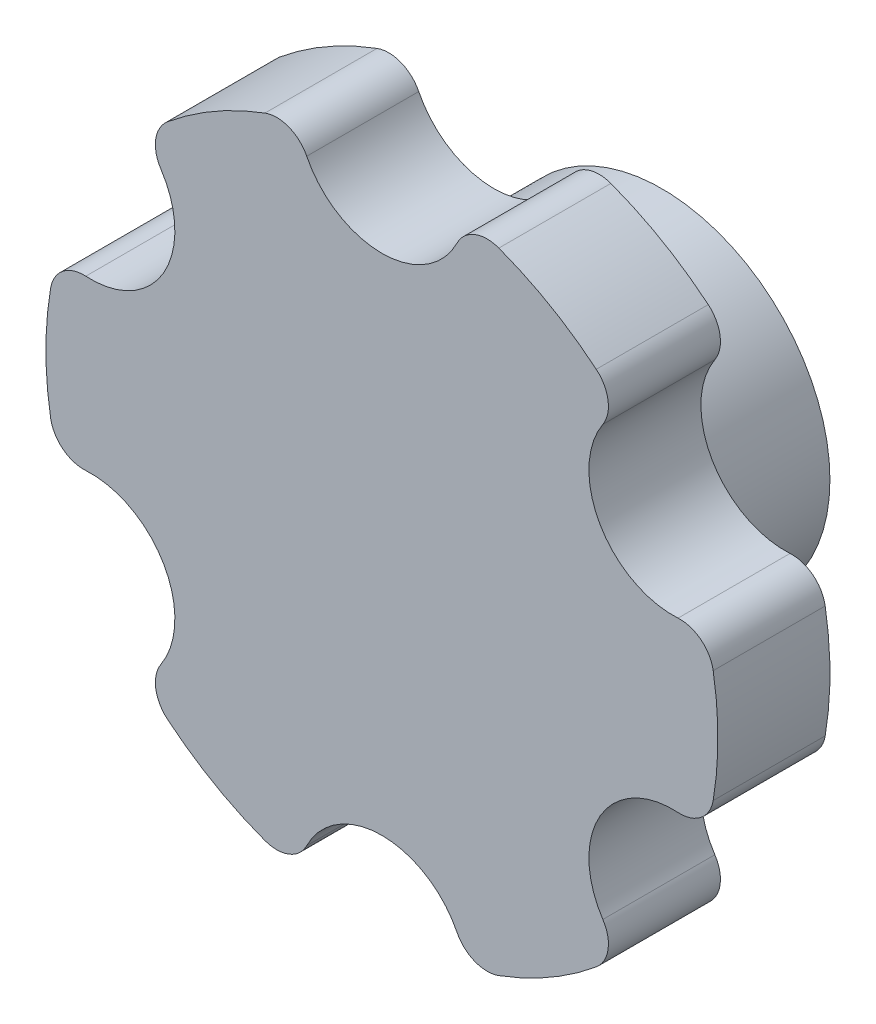
ISO-10303-21;
HEADER;
FILE_DESCRIPTION(('STEP AP214'),'2;1');
FILE_NAME('part.step','',(''),(''),'','','');
FILE_SCHEMA(('AUTOMOTIVE_DESIGN { 1 0 10303 214 1 1 1 1 }'));
ENDSEC;
DATA;
#1=APPLICATION_CONTEXT('core data for automotive mechanical design processes');
#2=APPLICATION_PROTOCOL_DEFINITION('international standard','automotive_design',2000,#1);
#3=PRODUCT_CONTEXT('',#1,'mechanical');
#4=PRODUCT('Part','Part','',(#3));
#5=PRODUCT_RELATED_PRODUCT_CATEGORY('part','',(#4));
#6=PRODUCT_DEFINITION_FORMATION('','',#4);
#7=PRODUCT_DEFINITION_CONTEXT('part definition',#1,'design');
#8=PRODUCT_DEFINITION('design','',#6,#7);
#9=PRODUCT_DEFINITION_SHAPE('','',#8);
#10=(LENGTH_UNIT() NAMED_UNIT(*) SI_UNIT(.MILLI.,.METRE.));
#11=(NAMED_UNIT(*) PLANE_ANGLE_UNIT() SI_UNIT($,.RADIAN.));
#12=(NAMED_UNIT(*) SI_UNIT($,.STERADIAN.) SOLID_ANGLE_UNIT());
#13=UNCERTAINTY_MEASURE_WITH_UNIT(LENGTH_MEASURE(1.E-05),#10,'distance_accuracy_value','');
#14=(GEOMETRIC_REPRESENTATION_CONTEXT(3) GLOBAL_UNCERTAINTY_ASSIGNED_CONTEXT((#13)) GLOBAL_UNIT_ASSIGNED_CONTEXT((#10,
#11,#12)) REPRESENTATION_CONTEXT('',''));
#15=CARTESIAN_POINT('',(0.,0.,0.));
#16=DIRECTION('',(0.,0.,1.));
#17=DIRECTION('',(1.,0.,0.));
#18=AXIS2_PLACEMENT_3D('',#15,#16,#17);
#19=CARTESIAN_POINT('',(0.,0.,25.));
#20=DIRECTION('',(0.,0.,-1.));
#21=DIRECTION('',(-1.,0.,0.));
#22=AXIS2_PLACEMENT_3D('',#19,#20,#21);
#23=CYLINDRICAL_SURFACE('',#22,30.);
#24=DIRECTION('',(0.,0.,-1.));
#25=VECTOR('',#24,1.);
#26=CARTESIAN_POINT('',(29.5767435715904,5.02157741156946,25.));
#27=LINE('',#26,#25);
#28=CARTESIAN_POINT('',(29.5767435715904,5.02157741156946,15.));
#29=VERTEX_POINT('',#28);
#30=CARTESIAN_POINT('',(29.5767435715904,5.02157741156946,25.));
#31=VERTEX_POINT('',#30);
#32=EDGE_CURVE('E274',#29,#31,#27,.F.);
#33=ORIENTED_EDGE('',*,*,#32,.T.);
#34=CARTESIAN_POINT('',(0.,0.,25.));
#35=DIRECTION('',(0.,0.,1.));
#36=DIRECTION('',(1.,0.,0.));
#37=AXIS2_PLACEMENT_3D('',#34,#35,#36);
#38=CIRCLE('',#37,30.);
#39=CARTESIAN_POINT('',(29.5767435715905,-5.02157741156884,25.));
#40=VERTEX_POINT('',#39);
#41=EDGE_CURVE('E416',#40,#31,#38,.T.);
#42=ORIENTED_EDGE('',*,*,#41,.F.);
#43=DIRECTION('',(0.,0.,-1.));
#44=VECTOR('',#43,1.);
#45=CARTESIAN_POINT('',(29.5767435715905,-5.02157741156884,25.));
#46=LINE('',#45,#44);
#47=CARTESIAN_POINT('',(29.5767435715905,-5.02157741156884,15.));
#48=VERTEX_POINT('',#47);
#49=EDGE_CURVE('E279',#40,#48,#46,.T.);
#50=ORIENTED_EDGE('',*,*,#49,.T.);
#51=CARTESIAN_POINT('',(0.,0.,15.));
#52=DIRECTION('',(0.,0.,1.));
#53=DIRECTION('',(1.,0.,0.));
#54=AXIS2_PLACEMENT_3D('',#51,#52,#53);
#55=CIRCLE('',#54,30.);
#56=EDGE_CURVE('E428',#48,#29,#55,.T.);
#57=ORIENTED_EDGE('',*,*,#56,.T.);
#58=EDGE_LOOP('',(#33,#42,#50,#57));
#59=FACE_BOUND('',#58,.T.);
#60=ADVANCED_FACE('F38',(#59),#23,.T.);
#61=DIRECTION('',(0.,0.,-1.));
#62=VECTOR('',#61,1.);
#63=CARTESIAN_POINT('',(19.1371853912839,23.1034225884311,25.));
#64=LINE('',#63,#62);
#65=CARTESIAN_POINT('',(19.1371853912839,23.1034225884311,25.));
#66=VERTEX_POINT('',#65);
#67=CARTESIAN_POINT('',(19.1371853912839,23.1034225884311,15.));
#68=VERTEX_POINT('',#67);
#69=EDGE_CURVE('E304',#66,#68,#64,.T.);
#70=ORIENTED_EDGE('',*,*,#69,.T.);
#71=CARTESIAN_POINT('',(10.4395581803063,28.125,15.));
#72=VERTEX_POINT('',#71);
#73=EDGE_CURVE('E351',#68,#72,#55,.T.);
#74=ORIENTED_EDGE('',*,*,#73,.T.);
#75=DIRECTION('',(0.,0.,-1.));
#76=VECTOR('',#75,1.);
#77=CARTESIAN_POINT('',(10.4395581803063,28.125,25.));
#78=LINE('',#77,#76);
#79=CARTESIAN_POINT('',(10.4395581803063,28.125,25.));
#80=VERTEX_POINT('',#79);
#81=EDGE_CURVE('E372',#72,#80,#78,.F.);
#82=ORIENTED_EDGE('',*,*,#81,.T.);
#83=EDGE_CURVE('E359',#66,#80,#38,.T.);
#84=ORIENTED_EDGE('',*,*,#83,.F.);
#85=EDGE_LOOP('',(#70,#74,#82,#84));
#86=FACE_BOUND('',#85,.T.);
#87=ADVANCED_FACE('F426',(#86),#23,.T.);
#88=DIRECTION('',(0.,0.,-1.));
#89=VECTOR('',#88,1.);
#90=CARTESIAN_POINT('',(19.1371853912844,-23.1034225884307,25.));
#91=LINE('',#90,#89);
#92=CARTESIAN_POINT('',(19.1371853912844,-23.1034225884307,15.));
#93=VERTEX_POINT('',#92);
#94=CARTESIAN_POINT('',(19.1371853912844,-23.1034225884307,25.));
#95=VERTEX_POINT('',#94);
#96=EDGE_CURVE('E246',#93,#95,#91,.F.);
#97=ORIENTED_EDGE('',*,*,#96,.T.);
#98=CARTESIAN_POINT('',(10.4395581803063,-28.125,25.));
#99=VERTEX_POINT('',#98);
#100=EDGE_CURVE('E414',#99,#95,#38,.T.);
#101=ORIENTED_EDGE('',*,*,#100,.F.);
#102=DIRECTION('',(0.,0.,-1.));
#103=VECTOR('',#102,1.);
#104=CARTESIAN_POINT('',(10.4395581803063,-28.125,25.));
#105=LINE('',#104,#103);
#106=CARTESIAN_POINT('',(10.4395581803063,-28.125,15.));
#107=VERTEX_POINT('',#106);
#108=EDGE_CURVE('E252',#99,#107,#105,.T.);
#109=ORIENTED_EDGE('',*,*,#108,.T.);
#110=EDGE_CURVE('E430',#107,#93,#55,.T.);
#111=ORIENTED_EDGE('',*,*,#110,.T.);
#112=EDGE_LOOP('',(#97,#101,#109,#111));
#113=FACE_BOUND('',#112,.T.);
#114=ADVANCED_FACE('F457',(#113),#23,.T.);
#115=DIRECTION('',(0.,0.,-1.));
#116=VECTOR('',#115,1.);
#117=CARTESIAN_POINT('',(-10.4395581803063,-28.125,25.));
#118=LINE('',#117,#116);
#119=CARTESIAN_POINT('',(-10.4395581803063,-28.125,15.));
#120=VERTEX_POINT('',#119);
#121=CARTESIAN_POINT('',(-10.4395581803063,-28.125,25.));
#122=VERTEX_POINT('',#121);
#123=EDGE_CURVE('E212',#120,#122,#118,.F.);
#124=ORIENTED_EDGE('',*,*,#123,.T.);
#125=CARTESIAN_POINT('',(-19.1371853912841,-23.103422588431,25.));
#126=VERTEX_POINT('',#125);
#127=EDGE_CURVE('E413',#126,#122,#38,.T.);
#128=ORIENTED_EDGE('',*,*,#127,.F.);
#129=DIRECTION('',(0.,0.,-1.));
#130=VECTOR('',#129,1.);
#131=CARTESIAN_POINT('',(-19.1371853912841,-23.103422588431,25.));
#132=LINE('',#131,#130);
#133=CARTESIAN_POINT('',(-19.1371853912841,-23.103422588431,15.));
#134=VERTEX_POINT('',#133);
#135=EDGE_CURVE('E207',#126,#134,#132,.T.);
#136=ORIENTED_EDGE('',*,*,#135,.T.);
#137=EDGE_CURVE('E434',#134,#120,#55,.T.);
#138=ORIENTED_EDGE('',*,*,#137,.T.);
#139=EDGE_LOOP('',(#124,#128,#136,#138));
#140=FACE_BOUND('',#139,.T.);
#141=ADVANCED_FACE('F466',(#140),#23,.T.);
#142=DIRECTION('',(0.,0.,-1.));
#143=VECTOR('',#142,1.);
#144=CARTESIAN_POINT('',(-29.5767435715905,-5.02157741156925,25.));
#145=LINE('',#144,#143);
#146=CARTESIAN_POINT('',(-29.5767435715905,-5.02157741156926,15.));
#147=VERTEX_POINT('',#146);
#148=CARTESIAN_POINT('',(-29.5767435715905,-5.02157741156926,25.));
#149=VERTEX_POINT('',#148);
#150=EDGE_CURVE('E238',#147,#149,#145,.F.);
#151=ORIENTED_EDGE('',*,*,#150,.T.);
#152=CARTESIAN_POINT('',(-29.5767435715905,5.02157741156905,25.));
#153=VERTEX_POINT('',#152);
#154=EDGE_CURVE('E358',#153,#149,#38,.T.);
#155=ORIENTED_EDGE('',*,*,#154,.F.);
#156=DIRECTION('',(0.,0.,-1.));
#157=VECTOR('',#156,1.);
#158=CARTESIAN_POINT('',(-29.5767435715905,5.02157741156905,25.));
#159=LINE('',#158,#157);
#160=CARTESIAN_POINT('',(-29.5767435715905,5.02157741156905,15.));
#161=VERTEX_POINT('',#160);
#162=EDGE_CURVE('E328',#153,#161,#159,.T.);
#163=ORIENTED_EDGE('',*,*,#162,.T.);
#164=EDGE_CURVE('E363',#161,#147,#55,.T.);
#165=ORIENTED_EDGE('',*,*,#164,.T.);
#166=EDGE_LOOP('',(#151,#155,#163,#165));
#167=FACE_BOUND('',#166,.T.);
#168=ADVANCED_FACE('F411',(#167),#23,.T.);
#169=DIRECTION('',(0.,0.,-1.));
#170=VECTOR('',#169,1.);
#171=CARTESIAN_POINT('',(-19.1371853912843,23.1034225884308,25.));
#172=LINE('',#171,#170);
#173=CARTESIAN_POINT('',(-19.1371853912843,23.1034225884308,15.));
#174=VERTEX_POINT('',#173);
#175=CARTESIAN_POINT('',(-19.1371853912843,23.1034225884308,25.));
#176=VERTEX_POINT('',#175);
#177=EDGE_CURVE('E344',#174,#176,#172,.F.);
#178=ORIENTED_EDGE('',*,*,#177,.T.);
#179=CARTESIAN_POINT('',(-10.4395581803063,28.125,25.));
#180=VERTEX_POINT('',#179);
#181=EDGE_CURVE('E354',#180,#176,#38,.T.);
#182=ORIENTED_EDGE('',*,*,#181,.F.);
#183=DIRECTION('',(0.,0.,-1.));
#184=VECTOR('',#183,1.);
#185=CARTESIAN_POINT('',(-10.4395581803063,28.125,25.));
#186=LINE('',#185,#184);
#187=CARTESIAN_POINT('',(-10.4395581803063,28.125,15.));
#188=VERTEX_POINT('',#187);
#189=EDGE_CURVE('E367',#180,#188,#186,.T.);
#190=ORIENTED_EDGE('',*,*,#189,.T.);
#191=EDGE_CURVE('E360',#188,#174,#55,.T.);
#192=ORIENTED_EDGE('',*,*,#191,.T.);
#193=EDGE_LOOP('',(#178,#182,#190,#192));
#194=FACE_BOUND('',#193,.T.);
#195=ADVANCED_FACE('F397',(#194),#23,.T.);
#196=CARTESIAN_POINT('',(0.,0.,25.));
#197=DIRECTION('',(0.,0.,1.));
#198=DIRECTION('',(1.,0.,0.));
#199=AXIS2_PLACEMENT_3D('',#196,#197,#198);
#200=PLANE('',#199);
#201=ORIENTED_EDGE('',*,*,#41,.T.);
#202=CARTESIAN_POINT('',(26.6190692144314,4.51941967041251,25.));
#203=DIRECTION('',(0.,0.,1.));
#204=DIRECTION('',(0.50000000000001,-0.866025403784433,0.));
#205=AXIS2_PLACEMENT_3D('',#202,#203,#204);
#206=CIRCLE('',#205,3.);
#207=CARTESIAN_POINT('',(26.4366957570318,7.51387119315187,25.));
#208=VERTEX_POINT('',#207);
#209=EDGE_CURVE('E315',#31,#208,#206,.T.);
#210=ORIENTED_EDGE('',*,*,#209,.T.);
#211=CARTESIAN_POINT('',(25.980762113533,15.0000000000003,25.));
#212=DIRECTION('',(0.,0.,1.));
#213=DIRECTION('',(0.50000000000001,-0.866025403784433,0.));
#214=AXIS2_PLACEMENT_3D('',#211,#212,#213);
#215=CIRCLE('',#214,7.5);
#216=CARTESIAN_POINT('',(19.7255512125491,19.1379145211344,25.));
#217=VERTEX_POINT('',#216);
#218=EDGE_CURVE('E307',#217,#208,#215,.T.);
#219=ORIENTED_EDGE('',*,*,#218,.F.);
#220=CARTESIAN_POINT('',(17.2234668521555,20.793080329588,25.));
#221=DIRECTION('',(0.,0.,1.));
#222=DIRECTION('',(0.50000000000001,-0.866025403784433,0.));
#223=AXIS2_PLACEMENT_3D('',#220,#221,#222);
#224=CIRCLE('',#223,3.);
#225=EDGE_CURVE('E295',#217,#66,#224,.T.);
#226=ORIENTED_EDGE('',*,*,#225,.T.);
#227=ORIENTED_EDGE('',*,*,#83,.T.);
#228=CARTESIAN_POINT('',(9.39560236227565,25.3125,25.));
#229=DIRECTION('',(0.,0.,1.));
#230=DIRECTION('',(1.,0.,0.));
#231=AXIS2_PLACEMENT_3D('',#228,#229,#230);
#232=CIRCLE('',#231,3.);
#233=CARTESIAN_POINT('',(6.71114454448261,26.6517857142857,25.));
#234=VERTEX_POINT('',#233);
#235=EDGE_CURVE('E377',#80,#234,#232,.T.);
#236=ORIENTED_EDGE('',*,*,#235,.T.);
#237=CARTESIAN_POINT('',(0.,30.,25.));
#238=DIRECTION('',(0.,0.,1.));
#239=DIRECTION('',(1.,0.,0.));
#240=AXIS2_PLACEMENT_3D('',#237,#238,#239);
#241=CIRCLE('',#240,7.5);
#242=CARTESIAN_POINT('',(-6.71114454448261,26.6517857142857,25.));
#243=VERTEX_POINT('',#242);
#244=EDGE_CURVE('E347',#243,#234,#241,.T.);
#245=ORIENTED_EDGE('',*,*,#244,.F.);
#246=CARTESIAN_POINT('',(-9.39560236227565,25.3125,25.));
#247=DIRECTION('',(0.,0.,1.));
#248=DIRECTION('',(1.,0.,0.));
#249=AXIS2_PLACEMENT_3D('',#246,#247,#248);
#250=CIRCLE('',#249,3.);
#251=EDGE_CURVE('E375',#243,#180,#250,.T.);
#252=ORIENTED_EDGE('',*,*,#251,.T.);
#253=ORIENTED_EDGE('',*,*,#181,.T.);
#254=CARTESIAN_POINT('',(-17.2234668521558,20.7930803295878,25.));
#255=DIRECTION('',(0.,0.,1.));
#256=DIRECTION('',(0.499999999999998,0.86602540378444,0.));
#257=AXIS2_PLACEMENT_3D('',#254,#255,#256);
#258=CIRCLE('',#257,3.);
#259=CARTESIAN_POINT('',(-19.7255512125494,19.1379145211341,25.));
#260=VERTEX_POINT('',#259);
#261=EDGE_CURVE('E341',#176,#260,#258,.T.);
#262=ORIENTED_EDGE('',*,*,#261,.T.);
#263=CARTESIAN_POINT('',(-25.9807621135332,14.9999999999999,25.));
#264=DIRECTION('',(0.,0.,1.));
#265=DIRECTION('',(0.499999999999998,0.86602540378444,0.));
#266=AXIS2_PLACEMENT_3D('',#263,#264,#265);
#267=CIRCLE('',#266,7.5);
#268=CARTESIAN_POINT('',(-26.4366957570319,7.5138711931515,25.));
#269=VERTEX_POINT('',#268);
#270=EDGE_CURVE('E331',#269,#260,#267,.T.);
#271=ORIENTED_EDGE('',*,*,#270,.F.);
#272=CARTESIAN_POINT('',(-26.6190692144314,4.51941967041214,25.));
#273=DIRECTION('',(0.,0.,1.));
#274=DIRECTION('',(0.499999999999998,0.86602540378444,0.));
#275=AXIS2_PLACEMENT_3D('',#272,#273,#274);
#276=CIRCLE('',#275,3.);
#277=EDGE_CURVE('E241',#269,#153,#276,.T.);
#278=ORIENTED_EDGE('',*,*,#277,.T.);
#279=ORIENTED_EDGE('',*,*,#154,.T.);
#280=CARTESIAN_POINT('',(-26.6190692144314,-4.51941967041233,25.));
#281=DIRECTION('',(0.,0.,1.));
#282=DIRECTION('',(-0.500000000000004,0.866025403784436,0.));
#283=AXIS2_PLACEMENT_3D('',#280,#281,#282);
#284=CIRCLE('',#283,3.);
#285=CARTESIAN_POINT('',(-26.4366957570319,-7.51387119315169,25.));
#286=VERTEX_POINT('',#285);
#287=EDGE_CURVE('E226',#149,#286,#284,.T.);
#288=ORIENTED_EDGE('',*,*,#287,.T.);
#289=CARTESIAN_POINT('',(-25.9807621135331,-15.0000000000001,25.));
#290=DIRECTION('',(0.,0.,1.));
#291=DIRECTION('',(-0.500000000000004,0.866025403784436,0.));
#292=AXIS2_PLACEMENT_3D('',#289,#290,#291);
#293=CIRCLE('',#292,7.5);
#294=CARTESIAN_POINT('',(-19.7255512125492,-19.1379145211342,25.));
#295=VERTEX_POINT('',#294);
#296=EDGE_CURVE('E216',#295,#286,#293,.T.);
#297=ORIENTED_EDGE('',*,*,#296,.F.);
#298=CARTESIAN_POINT('',(-17.2234668521557,-20.7930803295879,25.));
#299=DIRECTION('',(0.,0.,1.));
#300=DIRECTION('',(-0.500000000000004,0.866025403784436,0.));
#301=AXIS2_PLACEMENT_3D('',#298,#299,#300);
#302=CIRCLE('',#301,3.);
#303=EDGE_CURVE('E201',#295,#126,#302,.T.);
#304=ORIENTED_EDGE('',*,*,#303,.T.);
#305=ORIENTED_EDGE('',*,*,#127,.T.);
#306=CARTESIAN_POINT('',(-9.39560236227565,-25.3125,25.));
#307=DIRECTION('',(0.,0.,1.));
#308=DIRECTION('',(-1.,0.,0.));
#309=AXIS2_PLACEMENT_3D('',#306,#307,#308);
#310=CIRCLE('',#309,3.);
#311=CARTESIAN_POINT('',(-6.71114454448261,-26.6517857142857,25.));
#312=VERTEX_POINT('',#311);
#313=EDGE_CURVE('E265',#122,#312,#310,.T.);
#314=ORIENTED_EDGE('',*,*,#313,.T.);
#315=CARTESIAN_POINT('',(0.,-30.,25.));
#316=DIRECTION('',(0.,0.,1.));
#317=DIRECTION('',(-1.,0.,0.));
#318=AXIS2_PLACEMENT_3D('',#315,#316,#317);
#319=CIRCLE('',#318,7.5);
#320=CARTESIAN_POINT('',(6.71114454448261,-26.6517857142857,25.));
#321=VERTEX_POINT('',#320);
#322=EDGE_CURVE('E255',#321,#312,#319,.T.);
#323=ORIENTED_EDGE('',*,*,#322,.F.);
#324=CARTESIAN_POINT('',(9.39560236227565,-25.3125,25.));
#325=DIRECTION('',(0.,0.,1.));
#326=DIRECTION('',(-1.,0.,0.));
#327=AXIS2_PLACEMENT_3D('',#324,#325,#326);
#328=CIRCLE('',#327,3.);
#329=EDGE_CURVE('E242',#321,#99,#328,.T.);
#330=ORIENTED_EDGE('',*,*,#329,.T.);
#331=ORIENTED_EDGE('',*,*,#100,.T.);
#332=CARTESIAN_POINT('',(17.223466852156,-20.7930803295876,25.));
#333=DIRECTION('',(0.,0.,1.));
#334=DIRECTION('',(-0.499999999999992,-0.866025403784443,0.));
#335=AXIS2_PLACEMENT_3D('',#332,#333,#334);
#336=CIRCLE('',#335,3.);
#337=CARTESIAN_POINT('',(19.7255512125495,-19.137914521134,25.));
#338=VERTEX_POINT('',#337);
#339=EDGE_CURVE('E290',#95,#338,#336,.T.);
#340=ORIENTED_EDGE('',*,*,#339,.T.);
#341=CARTESIAN_POINT('',(25.9807621135333,-14.9999999999998,25.));
#342=DIRECTION('',(0.,0.,1.));
#343=DIRECTION('',(-0.499999999999992,-0.866025403784443,0.));
#344=AXIS2_PLACEMENT_3D('',#341,#342,#343);
#345=CIRCLE('',#344,7.5);
#346=CARTESIAN_POINT('',(26.436695757032,-7.51387119315132,25.));
#347=VERTEX_POINT('',#346);
#348=EDGE_CURVE('E282',#347,#338,#345,.T.);
#349=ORIENTED_EDGE('',*,*,#348,.F.);
#350=CARTESIAN_POINT('',(26.6190692144315,-4.51941967041196,25.));
#351=DIRECTION('',(0.,0.,1.));
#352=DIRECTION('',(-0.499999999999992,-0.866025403784443,0.));
#353=AXIS2_PLACEMENT_3D('',#350,#351,#352);
#354=CIRCLE('',#353,3.);
#355=EDGE_CURVE('E270',#347,#40,#354,.T.);
#356=ORIENTED_EDGE('',*,*,#355,.T.);
#357=EDGE_LOOP('',(#201,#210,#219,#226,#227,#236,#245,#252,#253,#262,#271,#278,#279,#288,#297,
#304,#305,#314,#323,#330,#331,#340,#349,#356));
#358=FACE_BOUND('',#357,.T.);
#359=ADVANCED_FACE('F224',(#358),#200,.T.);
#360=CARTESIAN_POINT('',(0.,0.,15.));
#361=DIRECTION('',(0.,0.,1.));
#362=DIRECTION('',(1.,0.,0.));
#363=AXIS2_PLACEMENT_3D('',#360,#361,#362);
#364=PLANE('',#363);
#365=CARTESIAN_POINT('',(0.,0.,15.));
#366=DIRECTION('',(0.,0.,1.));
#367=DIRECTION('',(1.,0.,0.));
#368=AXIS2_PLACEMENT_3D('',#365,#366,#367);
#369=CIRCLE('',#368,15.);
#370=CARTESIAN_POINT('',(15.,0.,15.));
#371=VERTEX_POINT('',#370);
#372=EDGE_CURVE('E364',#371,#371,#369,.T.);
#373=ORIENTED_EDGE('',*,*,#372,.T.);
#374=EDGE_LOOP('',(#373));
#375=FACE_BOUND('',#374,.T.);
#376=CARTESIAN_POINT('',(26.6190692144314,4.51941967041251,15.));
#377=DIRECTION('',(0.,0.,1.));
#378=DIRECTION('',(0.50000000000001,-0.866025403784433,0.));
#379=AXIS2_PLACEMENT_3D('',#376,#377,#378);
#380=CIRCLE('',#379,3.);
#381=CARTESIAN_POINT('',(26.4366957570318,7.51387119315187,15.));
#382=VERTEX_POINT('',#381);
#383=EDGE_CURVE('E312',#382,#29,#380,.F.);
#384=ORIENTED_EDGE('',*,*,#383,.T.);
#385=ORIENTED_EDGE('',*,*,#56,.F.);
#386=CARTESIAN_POINT('',(26.6190692144315,-4.51941967041196,15.));
#387=DIRECTION('',(0.,0.,1.));
#388=DIRECTION('',(-0.499999999999992,-0.866025403784443,0.));
#389=AXIS2_PLACEMENT_3D('',#386,#387,#388);
#390=CIRCLE('',#389,3.);
#391=CARTESIAN_POINT('',(26.436695757032,-7.51387119315133,15.));
#392=VERTEX_POINT('',#391);
#393=EDGE_CURVE('E276',#48,#392,#390,.F.);
#394=ORIENTED_EDGE('',*,*,#393,.T.);
#395=CARTESIAN_POINT('',(25.9807621135333,-14.9999999999998,15.));
#396=DIRECTION('',(0.,0.,1.));
#397=DIRECTION('',(-0.499999999999992,-0.866025403784443,0.));
#398=AXIS2_PLACEMENT_3D('',#395,#396,#397);
#399=CIRCLE('',#398,7.5);
#400=CARTESIAN_POINT('',(19.7255512125495,-19.137914521134,15.));
#401=VERTEX_POINT('',#400);
#402=EDGE_CURVE('E61',#392,#401,#399,.T.);
#403=ORIENTED_EDGE('',*,*,#402,.T.);
#404=CARTESIAN_POINT('',(17.223466852156,-20.7930803295876,15.));
#405=DIRECTION('',(0.,0.,1.));
#406=DIRECTION('',(-0.499999999999992,-0.866025403784443,0.));
#407=AXIS2_PLACEMENT_3D('',#404,#405,#406);
#408=CIRCLE('',#407,3.);
#409=EDGE_CURVE('E287',#401,#93,#408,.F.);
#410=ORIENTED_EDGE('',*,*,#409,.T.);
#411=ORIENTED_EDGE('',*,*,#110,.F.);
#412=CARTESIAN_POINT('',(9.39560236227565,-25.3125,15.));
#413=DIRECTION('',(0.,0.,1.));
#414=DIRECTION('',(-1.,0.,0.));
#415=AXIS2_PLACEMENT_3D('',#412,#413,#414);
#416=CIRCLE('',#415,3.);
#417=CARTESIAN_POINT('',(6.71114454448261,-26.6517857142857,15.));
#418=VERTEX_POINT('',#417);
#419=EDGE_CURVE('E249',#107,#418,#416,.F.);
#420=ORIENTED_EDGE('',*,*,#419,.T.);
#421=CARTESIAN_POINT('',(0.,-30.,15.));
#422=DIRECTION('',(0.,0.,1.));
#423=DIRECTION('',(-1.,0.,0.));
#424=AXIS2_PLACEMENT_3D('',#421,#422,#423);
#425=CIRCLE('',#424,7.5);
#426=CARTESIAN_POINT('',(-6.71114454448261,-26.6517857142857,15.));
#427=VERTEX_POINT('',#426);
#428=EDGE_CURVE('E259',#418,#427,#425,.T.);
#429=ORIENTED_EDGE('',*,*,#428,.T.);
#430=CARTESIAN_POINT('',(-9.39560236227565,-25.3125,15.));
#431=DIRECTION('',(0.,0.,1.));
#432=DIRECTION('',(-1.,0.,0.));
#433=AXIS2_PLACEMENT_3D('',#430,#431,#432);
#434=CIRCLE('',#433,3.);
#435=EDGE_CURVE('E262',#427,#120,#434,.F.);
#436=ORIENTED_EDGE('',*,*,#435,.T.);
#437=ORIENTED_EDGE('',*,*,#137,.F.);
#438=CARTESIAN_POINT('',(-17.2234668521557,-20.7930803295879,15.));
#439=DIRECTION('',(0.,0.,1.));
#440=DIRECTION('',(-0.500000000000004,0.866025403784436,0.));
#441=AXIS2_PLACEMENT_3D('',#438,#439,#440);
#442=CIRCLE('',#441,3.);
#443=CARTESIAN_POINT('',(-19.7255512125492,-19.1379145211342,15.));
#444=VERTEX_POINT('',#443);
#445=EDGE_CURVE('E220',#134,#444,#442,.F.);
#446=ORIENTED_EDGE('',*,*,#445,.T.);
#447=CARTESIAN_POINT('',(-25.9807621135331,-15.0000000000001,15.));
#448=DIRECTION('',(0.,0.,1.));
#449=DIRECTION('',(-0.500000000000004,0.866025403784436,0.));
#450=AXIS2_PLACEMENT_3D('',#447,#448,#449);
#451=CIRCLE('',#450,7.5);
#452=CARTESIAN_POINT('',(-26.4366957570319,-7.51387119315169,15.));
#453=VERTEX_POINT('',#452);
#454=EDGE_CURVE('E219',#444,#453,#451,.T.);
#455=ORIENTED_EDGE('',*,*,#454,.T.);
#456=CARTESIAN_POINT('',(-26.6190692144314,-4.51941967041233,15.));
#457=DIRECTION('',(0.,0.,1.));
#458=DIRECTION('',(-0.500000000000004,0.866025403784436,0.));
#459=AXIS2_PLACEMENT_3D('',#456,#457,#458);
#460=CIRCLE('',#459,3.);
#461=EDGE_CURVE('E234',#453,#147,#460,.F.);
#462=ORIENTED_EDGE('',*,*,#461,.T.);
#463=ORIENTED_EDGE('',*,*,#164,.F.);
#464=CARTESIAN_POINT('',(-26.6190692144314,4.51941967041214,15.));
#465=DIRECTION('',(0.,0.,1.));
#466=DIRECTION('',(0.499999999999998,0.86602540378444,0.));
#467=AXIS2_PLACEMENT_3D('',#464,#465,#466);
#468=CIRCLE('',#467,3.);
#469=CARTESIAN_POINT('',(-26.4366957570319,7.51387119315152,15.));
#470=VERTEX_POINT('',#469);
#471=EDGE_CURVE('E325',#161,#470,#468,.F.);
#472=ORIENTED_EDGE('',*,*,#471,.T.);
#473=CARTESIAN_POINT('',(-25.9807621135332,14.9999999999999,15.));
#474=DIRECTION('',(0.,0.,1.));
#475=DIRECTION('',(0.499999999999998,0.86602540378444,0.));
#476=AXIS2_PLACEMENT_3D('',#473,#474,#475);
#477=CIRCLE('',#476,7.5);
#478=CARTESIAN_POINT('',(-19.7255512125494,19.1379145211341,15.));
#479=VERTEX_POINT('',#478);
#480=EDGE_CURVE('E335',#470,#479,#477,.T.);
#481=ORIENTED_EDGE('',*,*,#480,.T.);
#482=CARTESIAN_POINT('',(-17.2234668521558,20.7930803295878,15.));
#483=DIRECTION('',(0.,0.,1.));
#484=DIRECTION('',(0.499999999999998,0.86602540378444,0.));
#485=AXIS2_PLACEMENT_3D('',#482,#483,#484);
#486=CIRCLE('',#485,3.);
#487=EDGE_CURVE('E338',#479,#174,#486,.F.);
#488=ORIENTED_EDGE('',*,*,#487,.T.);
#489=ORIENTED_EDGE('',*,*,#191,.F.);
#490=CARTESIAN_POINT('',(-9.39560236227565,25.3125,15.));
#491=DIRECTION('',(0.,0.,1.));
#492=DIRECTION('',(1.,0.,0.));
#493=AXIS2_PLACEMENT_3D('',#490,#491,#492);
#494=CIRCLE('',#493,3.);
#495=CARTESIAN_POINT('',(-6.71114454448261,26.6517857142857,15.));
#496=VERTEX_POINT('',#495);
#497=EDGE_CURVE('E46',#188,#496,#494,.F.);
#498=ORIENTED_EDGE('',*,*,#497,.T.);
#499=CARTESIAN_POINT('',(0.,30.,15.));
#500=DIRECTION('',(0.,0.,1.));
#501=DIRECTION('',(1.,0.,0.));
#502=AXIS2_PLACEMENT_3D('',#499,#500,#501);
#503=CIRCLE('',#502,7.5);
#504=CARTESIAN_POINT('',(6.71114454448261,26.6517857142857,15.));
#505=VERTEX_POINT('',#504);
#506=EDGE_CURVE('E348',#496,#505,#503,.T.);
#507=ORIENTED_EDGE('',*,*,#506,.T.);
#508=CARTESIAN_POINT('',(9.39560236227565,25.3125,15.));
#509=DIRECTION('',(0.,0.,1.));
#510=DIRECTION('',(1.,0.,0.));
#511=AXIS2_PLACEMENT_3D('',#508,#509,#510);
#512=CIRCLE('',#511,3.);
#513=EDGE_CURVE('E11',#505,#72,#512,.F.);
#514=ORIENTED_EDGE('',*,*,#513,.T.);
#515=ORIENTED_EDGE('',*,*,#73,.F.);
#516=CARTESIAN_POINT('',(17.2234668521555,20.793080329588,15.));
#517=DIRECTION('',(0.,0.,1.));
#518=DIRECTION('',(0.50000000000001,-0.866025403784433,0.));
#519=AXIS2_PLACEMENT_3D('',#516,#517,#518);
#520=CIRCLE('',#519,3.);
#521=CARTESIAN_POINT('',(19.7255512125491,19.1379145211344,15.));
#522=VERTEX_POINT('',#521);
#523=EDGE_CURVE('E301',#68,#522,#520,.F.);
#524=ORIENTED_EDGE('',*,*,#523,.T.);
#525=CARTESIAN_POINT('',(25.980762113533,15.0000000000003,15.));
#526=DIRECTION('',(0.,0.,1.));
#527=DIRECTION('',(0.50000000000001,-0.866025403784433,0.));
#528=AXIS2_PLACEMENT_3D('',#525,#526,#527);
#529=CIRCLE('',#528,7.5);
#530=EDGE_CURVE('E53',#522,#382,#529,.T.);
#531=ORIENTED_EDGE('',*,*,#530,.T.);
#532=EDGE_LOOP('',(#384,#385,#394,#403,#410,#411,#420,#429,#436,#437,#446,#455,#462,#463,#472,
#481,#488,#489,#498,#507,#514,#515,#524,#531));
#533=FACE_BOUND('',#532,.T.);
#534=ADVANCED_FACE('F385',(#375,#533),#364,.F.);
#535=CARTESIAN_POINT('',(0.,0.,15.));
#536=DIRECTION('',(0.,0.,-1.));
#537=DIRECTION('',(-1.,0.,0.));
#538=AXIS2_PLACEMENT_3D('',#535,#536,#537);
#539=CYLINDRICAL_SURFACE('',#538,15.);
#540=ORIENTED_EDGE('',*,*,#372,.F.);
#541=EDGE_LOOP('',(#540));
#542=FACE_BOUND('',#541,.T.);
#543=CARTESIAN_POINT('',(0.,0.,0.));
#544=DIRECTION('',(0.,0.,1.));
#545=DIRECTION('',(1.,0.,0.));
#546=AXIS2_PLACEMENT_3D('',#543,#544,#545);
#547=CIRCLE('',#546,15.);
#548=CARTESIAN_POINT('',(15.,0.,0.));
#549=VERTEX_POINT('',#548);
#550=EDGE_CURVE('E357',#549,#549,#547,.T.);
#551=ORIENTED_EDGE('',*,*,#550,.T.);
#552=EDGE_LOOP('',(#551));
#553=FACE_BOUND('',#552,.T.);
#554=ADVANCED_FACE('F514',(#542,#553),#539,.T.);
#555=CARTESIAN_POINT('',(0.,0.,0.));
#556=DIRECTION('',(0.,0.,1.));
#557=DIRECTION('',(1.,0.,0.));
#558=AXIS2_PLACEMENT_3D('',#555,#556,#557);
#559=PLANE('',#558);
#560=CARTESIAN_POINT('',(0.,0.,0.));
#561=DIRECTION('',(0.,0.,-1.));
#562=DIRECTION('',(-1.,0.,0.));
#563=AXIS2_PLACEMENT_3D('',#560,#561,#562);
#564=CIRCLE('',#563,4.25);
#565=CARTESIAN_POINT('',(-4.25,0.,0.));
#566=VERTEX_POINT('',#565);
#567=EDGE_CURVE('E668',#566,#566,#564,.T.);
#568=ORIENTED_EDGE('',*,*,#567,.F.);
#569=EDGE_LOOP('',(#568));
#570=FACE_BOUND('',#569,.T.);
#571=ORIENTED_EDGE('',*,*,#550,.F.);
#572=EDGE_LOOP('',(#571));
#573=FACE_BOUND('',#572,.T.);
#574=ADVANCED_FACE('F512',(#570,#573),#559,.F.);
#575=CARTESIAN_POINT('',(0.,30.,15.));
#576=DIRECTION('',(0.,0.,1.));
#577=DIRECTION('',(1.,0.,0.));
#578=AXIS2_PLACEMENT_3D('',#575,#576,#577);
#579=CYLINDRICAL_SURFACE('',#578,7.5);
#580=ORIENTED_EDGE('',*,*,#244,.T.);
#581=DIRECTION('',(0.,0.,1.));
#582=VECTOR('',#581,1.);
#583=CARTESIAN_POINT('',(6.71114454448261,26.6517857142857,15.));
#584=LINE('',#583,#582);
#585=EDGE_CURVE('E381',#234,#505,#584,.F.);
#586=ORIENTED_EDGE('',*,*,#585,.T.);
#587=ORIENTED_EDGE('',*,*,#506,.F.);
#588=DIRECTION('',(0.,0.,1.));
#589=VECTOR('',#588,1.);
#590=CARTESIAN_POINT('',(-6.71114454448261,26.6517857142857,15.));
#591=LINE('',#590,#589);
#592=EDGE_CURVE('E379',#496,#243,#591,.T.);
#593=ORIENTED_EDGE('',*,*,#592,.T.);
#594=EDGE_LOOP('',(#580,#586,#587,#593));
#595=FACE_BOUND('',#594,.T.);
#596=ADVANCED_FACE('F391',(#595),#579,.F.);
#597=CARTESIAN_POINT('',(9.39560236227565,25.3125,15.));
#598=DIRECTION('',(0.,0.,-1.));
#599=DIRECTION('',(-1.,0.,0.));
#600=AXIS2_PLACEMENT_3D('',#597,#598,#599);
#601=CYLINDRICAL_SURFACE('',#600,3.);
#602=ORIENTED_EDGE('',*,*,#513,.F.);
#603=ORIENTED_EDGE('',*,*,#585,.F.);
#604=ORIENTED_EDGE('',*,*,#235,.F.);
#605=ORIENTED_EDGE('',*,*,#81,.F.);
#606=EDGE_LOOP('',(#602,#603,#604,#605));
#607=FACE_BOUND('',#606,.T.);
#608=ADVANCED_FACE('F425',(#607),#601,.T.);
#609=CARTESIAN_POINT('',(-9.39560236227565,25.3125,15.));
#610=DIRECTION('',(0.,0.,1.));
#611=DIRECTION('',(1.,0.,0.));
#612=AXIS2_PLACEMENT_3D('',#609,#610,#611);
#613=CYLINDRICAL_SURFACE('',#612,3.);
#614=ORIENTED_EDGE('',*,*,#251,.F.);
#615=ORIENTED_EDGE('',*,*,#592,.F.);
#616=ORIENTED_EDGE('',*,*,#497,.F.);
#617=ORIENTED_EDGE('',*,*,#189,.F.);
#618=EDGE_LOOP('',(#614,#615,#616,#617));
#619=FACE_BOUND('',#618,.T.);
#620=ADVANCED_FACE('F40',(#619),#613,.T.);
#621=CARTESIAN_POINT('',(-17.2234668521558,20.7930803295878,15.));
#622=DIRECTION('',(0.,0.,-1.));
#623=DIRECTION('',(-0.499999999999998,-0.86602540378444,0.));
#624=AXIS2_PLACEMENT_3D('',#621,#622,#623);
#625=CYLINDRICAL_SURFACE('',#624,3.);
#626=ORIENTED_EDGE('',*,*,#487,.F.);
#627=DIRECTION('',(0.,0.,1.));
#628=VECTOR('',#627,1.);
#629=CARTESIAN_POINT('',(-19.7255512125494,19.1379145211341,15.));
#630=LINE('',#629,#628);
#631=EDGE_CURVE('E333',#260,#479,#630,.F.);
#632=ORIENTED_EDGE('',*,*,#631,.F.);
#633=ORIENTED_EDGE('',*,*,#261,.F.);
#634=ORIENTED_EDGE('',*,*,#177,.F.);
#635=EDGE_LOOP('',(#626,#632,#633,#634));
#636=FACE_BOUND('',#635,.T.);
#637=ADVANCED_FACE('F400',(#636),#625,.T.);
#638=CARTESIAN_POINT('',(-25.9807621135332,14.9999999999999,15.));
#639=DIRECTION('',(0.,0.,1.));
#640=DIRECTION('',(0.499999999999998,0.86602540378444,0.));
#641=AXIS2_PLACEMENT_3D('',#638,#639,#640);
#642=CYLINDRICAL_SURFACE('',#641,7.5);
#643=ORIENTED_EDGE('',*,*,#270,.T.);
#644=ORIENTED_EDGE('',*,*,#631,.T.);
#645=ORIENTED_EDGE('',*,*,#480,.F.);
#646=DIRECTION('',(0.,0.,1.));
#647=VECTOR('',#646,1.);
#648=CARTESIAN_POINT('',(-26.4366957570319,7.5138711931515,15.));
#649=LINE('',#648,#647);
#650=EDGE_CURVE('E322',#470,#269,#649,.T.);
#651=ORIENTED_EDGE('',*,*,#650,.T.);
#652=EDGE_LOOP('',(#643,#644,#645,#651));
#653=FACE_BOUND('',#652,.T.);
#654=ADVANCED_FACE('F405',(#653),#642,.F.);
#655=CARTESIAN_POINT('',(-26.6190692144314,4.51941967041214,15.));
#656=DIRECTION('',(0.,0.,1.));
#657=DIRECTION('',(0.499999999999998,0.86602540378444,0.));
#658=AXIS2_PLACEMENT_3D('',#655,#656,#657);
#659=CYLINDRICAL_SURFACE('',#658,3.);
#660=ORIENTED_EDGE('',*,*,#277,.F.);
#661=ORIENTED_EDGE('',*,*,#650,.F.);
#662=ORIENTED_EDGE('',*,*,#471,.F.);
#663=ORIENTED_EDGE('',*,*,#162,.F.);
#664=EDGE_LOOP('',(#660,#661,#662,#663));
#665=FACE_BOUND('',#664,.T.);
#666=ADVANCED_FACE('F408',(#665),#659,.T.);
#667=CARTESIAN_POINT('',(-26.6190692144314,-4.51941967041233,15.));
#668=DIRECTION('',(0.,0.,-1.));
#669=DIRECTION('',(0.500000000000004,-0.866025403784436,0.));
#670=AXIS2_PLACEMENT_3D('',#667,#668,#669);
#671=CYLINDRICAL_SURFACE('',#670,3.);
#672=ORIENTED_EDGE('',*,*,#461,.F.);
#673=DIRECTION('',(0.,0.,1.));
#674=VECTOR('',#673,1.);
#675=CARTESIAN_POINT('',(-26.4366957570319,-7.51387119315169,15.));
#676=LINE('',#675,#674);
#677=EDGE_CURVE('E227',#286,#453,#676,.F.);
#678=ORIENTED_EDGE('',*,*,#677,.F.);
#679=ORIENTED_EDGE('',*,*,#287,.F.);
#680=ORIENTED_EDGE('',*,*,#150,.F.);
#681=EDGE_LOOP('',(#672,#678,#679,#680));
#682=FACE_BOUND('',#681,.T.);
#683=ADVANCED_FACE('F442',(#682),#671,.T.);
#684=CARTESIAN_POINT('',(-25.9807621135331,-15.0000000000001,15.));
#685=DIRECTION('',(0.,0.,1.));
#686=DIRECTION('',(-0.500000000000004,0.866025403784436,0.));
#687=AXIS2_PLACEMENT_3D('',#684,#685,#686);
#688=CYLINDRICAL_SURFACE('',#687,7.5);
#689=ORIENTED_EDGE('',*,*,#296,.T.);
#690=ORIENTED_EDGE('',*,*,#677,.T.);
#691=ORIENTED_EDGE('',*,*,#454,.F.);
#692=DIRECTION('',(0.,0.,1.));
#693=VECTOR('',#692,1.);
#694=CARTESIAN_POINT('',(-19.7255512125492,-19.1379145211342,15.));
#695=LINE('',#694,#693);
#696=EDGE_CURVE('E204',#444,#295,#695,.T.);
#697=ORIENTED_EDGE('',*,*,#696,.T.);
#698=EDGE_LOOP('',(#689,#690,#691,#697));
#699=FACE_BOUND('',#698,.T.);
#700=ADVANCED_FACE('F215',(#699),#688,.F.);
#701=CARTESIAN_POINT('',(-17.2234668521557,-20.7930803295879,15.));
#702=DIRECTION('',(0.,0.,1.));
#703=DIRECTION('',(-0.500000000000004,0.866025403784436,0.));
#704=AXIS2_PLACEMENT_3D('',#701,#702,#703);
#705=CYLINDRICAL_SURFACE('',#704,3.);
#706=ORIENTED_EDGE('',*,*,#303,.F.);
#707=ORIENTED_EDGE('',*,*,#696,.F.);
#708=ORIENTED_EDGE('',*,*,#445,.F.);
#709=ORIENTED_EDGE('',*,*,#135,.F.);
#710=EDGE_LOOP('',(#706,#707,#708,#709));
#711=FACE_BOUND('',#710,.T.);
#712=ADVANCED_FACE('F203',(#711),#705,.T.);
#713=CARTESIAN_POINT('',(-9.39560236227565,-25.3125,15.));
#714=DIRECTION('',(0.,0.,-1.));
#715=DIRECTION('',(1.,0.,0.));
#716=AXIS2_PLACEMENT_3D('',#713,#714,#715);
#717=CYLINDRICAL_SURFACE('',#716,3.);
#718=ORIENTED_EDGE('',*,*,#435,.F.);
#719=DIRECTION('',(0.,0.,1.));
#720=VECTOR('',#719,1.);
#721=CARTESIAN_POINT('',(-6.71114454448261,-26.6517857142857,15.));
#722=LINE('',#721,#720);
#723=EDGE_CURVE('E257',#312,#427,#722,.F.);
#724=ORIENTED_EDGE('',*,*,#723,.F.);
#725=ORIENTED_EDGE('',*,*,#313,.F.);
#726=ORIENTED_EDGE('',*,*,#123,.F.);
#727=EDGE_LOOP('',(#718,#724,#725,#726));
#728=FACE_BOUND('',#727,.T.);
#729=ADVANCED_FACE('F475',(#728),#717,.T.);
#730=CARTESIAN_POINT('',(0.,-30.,15.));
#731=DIRECTION('',(0.,0.,1.));
#732=DIRECTION('',(-1.,0.,0.));
#733=AXIS2_PLACEMENT_3D('',#730,#731,#732);
#734=CYLINDRICAL_SURFACE('',#733,7.5);
#735=ORIENTED_EDGE('',*,*,#322,.T.);
#736=ORIENTED_EDGE('',*,*,#723,.T.);
#737=ORIENTED_EDGE('',*,*,#428,.F.);
#738=DIRECTION('',(0.,0.,1.));
#739=VECTOR('',#738,1.);
#740=CARTESIAN_POINT('',(6.71114454448261,-26.6517857142857,15.));
#741=LINE('',#740,#739);
#742=EDGE_CURVE('E245',#418,#321,#741,.T.);
#743=ORIENTED_EDGE('',*,*,#742,.T.);
#744=EDGE_LOOP('',(#735,#736,#737,#743));
#745=FACE_BOUND('',#744,.T.);
#746=ADVANCED_FACE('F479',(#745),#734,.F.);
#747=CARTESIAN_POINT('',(9.39560236227565,-25.3125,15.));
#748=DIRECTION('',(0.,0.,1.));
#749=DIRECTION('',(-1.,0.,0.));
#750=AXIS2_PLACEMENT_3D('',#747,#748,#749);
#751=CYLINDRICAL_SURFACE('',#750,3.);
#752=ORIENTED_EDGE('',*,*,#329,.F.);
#753=ORIENTED_EDGE('',*,*,#742,.F.);
#754=ORIENTED_EDGE('',*,*,#419,.F.);
#755=ORIENTED_EDGE('',*,*,#108,.F.);
#756=EDGE_LOOP('',(#752,#753,#754,#755));
#757=FACE_BOUND('',#756,.T.);
#758=ADVANCED_FACE('F482',(#757),#751,.T.);
#759=CARTESIAN_POINT('',(17.223466852156,-20.7930803295876,15.));
#760=DIRECTION('',(0.,0.,-1.));
#761=DIRECTION('',(0.499999999999992,0.866025403784443,0.));
#762=AXIS2_PLACEMENT_3D('',#759,#760,#761);
#763=CYLINDRICAL_SURFACE('',#762,3.);
#764=ORIENTED_EDGE('',*,*,#409,.F.);
#765=DIRECTION('',(0.,0.,1.));
#766=VECTOR('',#765,1.);
#767=CARTESIAN_POINT('',(19.7255512125495,-19.137914521134,15.));
#768=LINE('',#767,#766);
#769=EDGE_CURVE('E284',#338,#401,#768,.F.);
#770=ORIENTED_EDGE('',*,*,#769,.F.);
#771=ORIENTED_EDGE('',*,*,#339,.F.);
#772=ORIENTED_EDGE('',*,*,#96,.F.);
#773=EDGE_LOOP('',(#764,#770,#771,#772));
#774=FACE_BOUND('',#773,.T.);
#775=ADVANCED_FACE('F485',(#774),#763,.T.);
#776=CARTESIAN_POINT('',(25.9807621135333,-14.9999999999998,15.));
#777=DIRECTION('',(0.,0.,1.));
#778=DIRECTION('',(-0.499999999999992,-0.866025403784443,0.));
#779=AXIS2_PLACEMENT_3D('',#776,#777,#778);
#780=CYLINDRICAL_SURFACE('',#779,7.5);
#781=ORIENTED_EDGE('',*,*,#348,.T.);
#782=ORIENTED_EDGE('',*,*,#769,.T.);
#783=ORIENTED_EDGE('',*,*,#402,.F.);
#784=DIRECTION('',(0.,0.,1.));
#785=VECTOR('',#784,1.);
#786=CARTESIAN_POINT('',(26.436695757032,-7.51387119315132,15.));
#787=LINE('',#786,#785);
#788=EDGE_CURVE('E273',#392,#347,#787,.T.);
#789=ORIENTED_EDGE('',*,*,#788,.T.);
#790=EDGE_LOOP('',(#781,#782,#783,#789));
#791=FACE_BOUND('',#790,.T.);
#792=ADVANCED_FACE('F598',(#791),#780,.F.);
#793=CARTESIAN_POINT('',(26.6190692144315,-4.51941967041196,15.));
#794=DIRECTION('',(0.,0.,1.));
#795=DIRECTION('',(-0.499999999999992,-0.866025403784443,0.));
#796=AXIS2_PLACEMENT_3D('',#793,#794,#795);
#797=CYLINDRICAL_SURFACE('',#796,3.);
#798=ORIENTED_EDGE('',*,*,#355,.F.);
#799=ORIENTED_EDGE('',*,*,#788,.F.);
#800=ORIENTED_EDGE('',*,*,#393,.F.);
#801=ORIENTED_EDGE('',*,*,#49,.F.);
#802=EDGE_LOOP('',(#798,#799,#800,#801));
#803=FACE_BOUND('',#802,.T.);
#804=ADVANCED_FACE('F488',(#803),#797,.T.);
#805=CARTESIAN_POINT('',(26.6190692144314,4.51941967041251,15.));
#806=DIRECTION('',(0.,0.,-1.));
#807=DIRECTION('',(-0.50000000000001,0.866025403784433,0.));
#808=AXIS2_PLACEMENT_3D('',#805,#806,#807);
#809=CYLINDRICAL_SURFACE('',#808,3.);
#810=ORIENTED_EDGE('',*,*,#383,.F.);
#811=DIRECTION('',(0.,0.,1.));
#812=VECTOR('',#811,1.);
#813=CARTESIAN_POINT('',(26.4366957570318,7.51387119315187,15.));
#814=LINE('',#813,#812);
#815=EDGE_CURVE('E309',#208,#382,#814,.F.);
#816=ORIENTED_EDGE('',*,*,#815,.F.);
#817=ORIENTED_EDGE('',*,*,#209,.F.);
#818=ORIENTED_EDGE('',*,*,#32,.F.);
#819=EDGE_LOOP('',(#810,#816,#817,#818));
#820=FACE_BOUND('',#819,.T.);
#821=ADVANCED_FACE('F491',(#820),#809,.T.);
#822=CARTESIAN_POINT('',(25.980762113533,15.0000000000003,15.));
#823=DIRECTION('',(0.,0.,1.));
#824=DIRECTION('',(0.50000000000001,-0.866025403784433,0.));
#825=AXIS2_PLACEMENT_3D('',#822,#823,#824);
#826=CYLINDRICAL_SURFACE('',#825,7.5);
#827=ORIENTED_EDGE('',*,*,#218,.T.);
#828=ORIENTED_EDGE('',*,*,#815,.T.);
#829=ORIENTED_EDGE('',*,*,#530,.F.);
#830=DIRECTION('',(0.,0.,1.));
#831=VECTOR('',#830,1.);
#832=CARTESIAN_POINT('',(19.7255512125491,19.1379145211344,15.));
#833=LINE('',#832,#831);
#834=EDGE_CURVE('E298',#522,#217,#833,.T.);
#835=ORIENTED_EDGE('',*,*,#834,.T.);
#836=EDGE_LOOP('',(#827,#828,#829,#835));
#837=FACE_BOUND('',#836,.T.);
#838=ADVANCED_FACE('F495',(#837),#826,.F.);
#839=CARTESIAN_POINT('',(17.2234668521555,20.793080329588,15.));
#840=DIRECTION('',(0.,0.,1.));
#841=DIRECTION('',(0.50000000000001,-0.866025403784433,0.));
#842=AXIS2_PLACEMENT_3D('',#839,#840,#841);
#843=CYLINDRICAL_SURFACE('',#842,3.);
#844=ORIENTED_EDGE('',*,*,#225,.F.);
#845=ORIENTED_EDGE('',*,*,#834,.F.);
#846=ORIENTED_EDGE('',*,*,#523,.F.);
#847=ORIENTED_EDGE('',*,*,#69,.F.);
#848=EDGE_LOOP('',(#844,#845,#846,#847));
#849=FACE_BOUND('',#848,.T.);
#850=ADVANCED_FACE('F494',(#849),#843,.T.);
#851=CARTESIAN_POINT('',(0.,0.,15.));
#852=DIRECTION('',(0.,0.,-1.));
#853=DIRECTION('',(-1.,0.,0.));
#854=AXIS2_PLACEMENT_3D('',#851,#852,#853);
#855=CYLINDRICAL_SURFACE('',#854,4.25);
#856=CARTESIAN_POINT('',(0.,0.,15.));
#857=DIRECTION('',(0.,0.,-1.));
#858=DIRECTION('',(-1.,0.,0.));
#859=AXIS2_PLACEMENT_3D('',#856,#857,#858);
#860=CIRCLE('',#859,4.25);
#861=CARTESIAN_POINT('',(-4.25,0.,15.));
#862=VERTEX_POINT('',#861);
#863=EDGE_CURVE('E299',#862,#862,#860,.T.);
#864=ORIENTED_EDGE('',*,*,#863,.F.);
#865=EDGE_LOOP('',(#864));
#866=FACE_BOUND('',#865,.T.);
#867=ORIENTED_EDGE('',*,*,#567,.T.);
#868=EDGE_LOOP('',(#867));
#869=FACE_BOUND('',#868,.T.);
#870=ADVANCED_FACE('F502',(#866,#869),#855,.F.);
#871=CARTESIAN_POINT('',(0.,0.,15.));
#872=DIRECTION('',(0.,0.,-1.));
#873=DIRECTION('',(-1.,0.,0.));
#874=AXIS2_PLACEMENT_3D('',#871,#872,#873);
#875=PLANE('',#874);
#876=ORIENTED_EDGE('',*,*,#863,.T.);
#877=EDGE_LOOP('',(#876));
#878=FACE_BOUND('',#877,.T.);
#879=ADVANCED_FACE('F648',(#878),#875,.T.);
#880=CLOSED_SHELL('',(#60,#87,#114,#141,#168,#195,#359,#534,#554,#574,#596,#608,#620,#637,#654,
#666,#683,#700,#712,#729,#746,#758,#775,#792,#804,#821,#838,#850,#870,#879));
#881=MANIFOLD_SOLID_BREP('B2',#880);
#882=ADVANCED_BREP_SHAPE_REPRESENTATION('',(#18,#881),#14);
#883=SHAPE_DEFINITION_REPRESENTATION(#9,#882);
ENDSEC;
END-ISO-10303-21;
